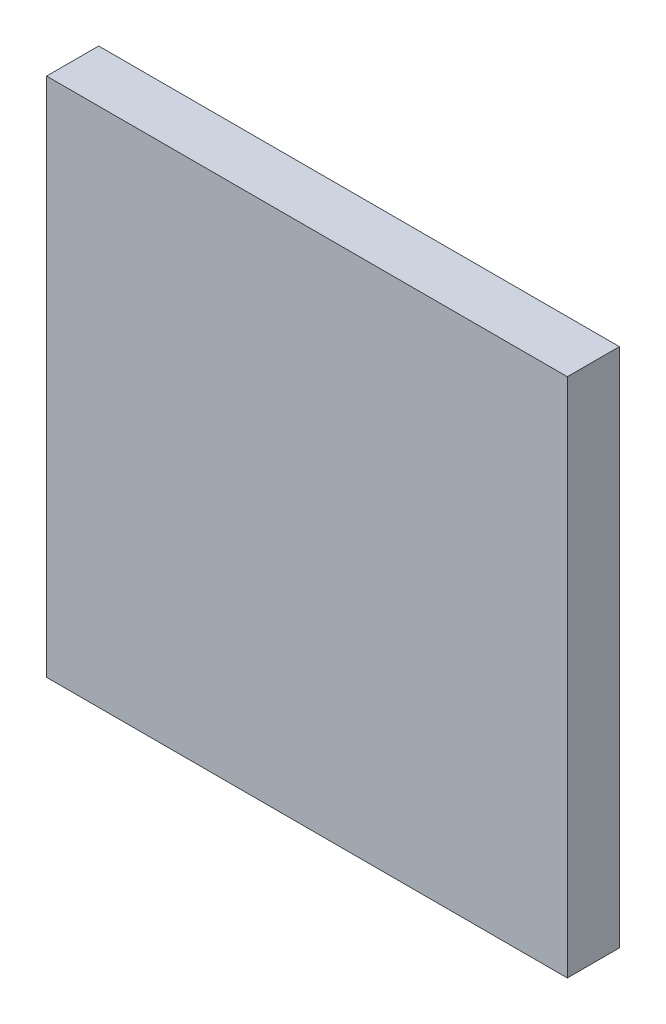
ISO-10303-21;
HEADER;
FILE_DESCRIPTION(('STEP AP214'),'2;1');
FILE_NAME('part.step','',(''),(''),'','','');
FILE_SCHEMA(('AUTOMOTIVE_DESIGN { 1 0 10303 214 1 1 1 1 }'));
ENDSEC;
DATA;
#1=APPLICATION_CONTEXT('core data for automotive mechanical design processes');
#2=APPLICATION_PROTOCOL_DEFINITION('international standard','automotive_design',2000,#1);
#3=PRODUCT_CONTEXT('',#1,'mechanical');
#4=PRODUCT('Part','Part','',(#3));
#5=PRODUCT_RELATED_PRODUCT_CATEGORY('part','',(#4));
#6=PRODUCT_DEFINITION_FORMATION('','',#4);
#7=PRODUCT_DEFINITION_CONTEXT('part definition',#1,'design');
#8=PRODUCT_DEFINITION('design','',#6,#7);
#9=PRODUCT_DEFINITION_SHAPE('','',#8);
#10=(LENGTH_UNIT() NAMED_UNIT(*) SI_UNIT(.MILLI.,.METRE.));
#11=(NAMED_UNIT(*) PLANE_ANGLE_UNIT() SI_UNIT($,.RADIAN.));
#12=(NAMED_UNIT(*) SI_UNIT($,.STERADIAN.) SOLID_ANGLE_UNIT());
#13=UNCERTAINTY_MEASURE_WITH_UNIT(LENGTH_MEASURE(1.E-05),#10,'distance_accuracy_value','');
#14=(GEOMETRIC_REPRESENTATION_CONTEXT(3) GLOBAL_UNCERTAINTY_ASSIGNED_CONTEXT((#13)) GLOBAL_UNIT_ASSIGNED_CONTEXT((#10,
#11,#12)) REPRESENTATION_CONTEXT('',''));
#15=CARTESIAN_POINT('',(0.,0.,0.));
#16=DIRECTION('',(0.,0.,1.));
#17=DIRECTION('',(1.,0.,0.));
#18=AXIS2_PLACEMENT_3D('',#15,#16,#17);
#19=CARTESIAN_POINT('',(-50.,100.,10.));
#20=DIRECTION('',(1.,0.,0.));
#21=DIRECTION('',(0.,1.,0.));
#22=AXIS2_PLACEMENT_3D('',#19,#20,#21);
#23=PLANE('',#22);
#24=DIRECTION('',(0.,-1.,0.));
#25=VECTOR('',#24,1.);
#26=CARTESIAN_POINT('',(-50.,100.,0.));
#27=LINE('',#26,#25);
#28=CARTESIAN_POINT('',(-50.,100.,0.));
#29=VERTEX_POINT('',#28);
#30=CARTESIAN_POINT('',(-50.,0.,0.));
#31=VERTEX_POINT('',#30);
#32=EDGE_CURVE('E142',#29,#31,#27,.T.);
#33=ORIENTED_EDGE('',*,*,#32,.T.);
#34=DIRECTION('',(0.,0.,-1.));
#35=VECTOR('',#34,1.);
#36=CARTESIAN_POINT('',(-50.,0.,10.));
#37=LINE('',#36,#35);
#38=CARTESIAN_POINT('',(-50.,0.,10.));
#39=VERTEX_POINT('',#38);
#40=EDGE_CURVE('E11',#39,#31,#37,.T.);
#41=ORIENTED_EDGE('',*,*,#40,.F.);
#42=DIRECTION('',(0.,-1.,0.));
#43=VECTOR('',#42,1.);
#44=CARTESIAN_POINT('',(-50.,100.,10.));
#45=LINE('',#44,#43);
#46=CARTESIAN_POINT('',(-50.,100.,10.));
#47=VERTEX_POINT('',#46);
#48=EDGE_CURVE('E146',#47,#39,#45,.T.);
#49=ORIENTED_EDGE('',*,*,#48,.F.);
#50=DIRECTION('',(0.,0.,-1.));
#51=VECTOR('',#50,1.);
#52=CARTESIAN_POINT('',(-50.,100.,10.));
#53=LINE('',#52,#51);
#54=EDGE_CURVE('E152',#47,#29,#53,.T.);
#55=ORIENTED_EDGE('',*,*,#54,.T.);
#56=EDGE_LOOP('',(#33,#41,#49,#55));
#57=FACE_BOUND('',#56,.T.);
#58=ADVANCED_FACE('F34',(#57),#23,.F.);
#59=CARTESIAN_POINT('',(-50.,0.,10.));
#60=DIRECTION('',(0.,1.,0.));
#61=DIRECTION('',(0.,0.,1.));
#62=AXIS2_PLACEMENT_3D('',#59,#60,#61);
#63=PLANE('',#62);
#64=DIRECTION('',(1.,0.,0.));
#65=VECTOR('',#64,1.);
#66=CARTESIAN_POINT('',(-50.,0.,0.));
#67=LINE('',#66,#65);
#68=CARTESIAN_POINT('',(50.,0.,0.));
#69=VERTEX_POINT('',#68);
#70=EDGE_CURVE('E155',#31,#69,#67,.T.);
#71=ORIENTED_EDGE('',*,*,#70,.T.);
#72=DIRECTION('',(0.,0.,-1.));
#73=VECTOR('',#72,1.);
#74=CARTESIAN_POINT('',(50.,0.,10.));
#75=LINE('',#74,#73);
#76=CARTESIAN_POINT('',(50.,0.,10.));
#77=VERTEX_POINT('',#76);
#78=EDGE_CURVE('E41',#77,#69,#75,.T.);
#79=ORIENTED_EDGE('',*,*,#78,.F.);
#80=DIRECTION('',(1.,0.,0.));
#81=VECTOR('',#80,1.);
#82=CARTESIAN_POINT('',(-50.,0.,10.));
#83=LINE('',#82,#81);
#84=EDGE_CURVE('E85',#39,#77,#83,.T.);
#85=ORIENTED_EDGE('',*,*,#84,.F.);
#86=ORIENTED_EDGE('',*,*,#40,.T.);
#87=EDGE_LOOP('',(#71,#79,#85,#86));
#88=FACE_BOUND('',#87,.T.);
#89=ADVANCED_FACE('F183',(#88),#63,.F.);
#90=CARTESIAN_POINT('',(50.,100.,10.));
#91=DIRECTION('',(-1.,0.,0.));
#92=DIRECTION('',(0.,-1.,0.));
#93=AXIS2_PLACEMENT_3D('',#90,#91,#92);
#94=PLANE('',#93);
#95=DIRECTION('',(0.,1.,0.));
#96=VECTOR('',#95,1.);
#97=CARTESIAN_POINT('',(50.,100.,0.));
#98=LINE('',#97,#96);
#99=CARTESIAN_POINT('',(50.,100.,0.));
#100=VERTEX_POINT('',#99);
#101=EDGE_CURVE('E157',#69,#100,#98,.T.);
#102=ORIENTED_EDGE('',*,*,#101,.T.);
#103=DIRECTION('',(0.,0.,-1.));
#104=VECTOR('',#103,1.);
#105=CARTESIAN_POINT('',(50.,100.,10.));
#106=LINE('',#105,#104);
#107=CARTESIAN_POINT('',(50.,100.,10.));
#108=VERTEX_POINT('',#107);
#109=EDGE_CURVE('E161',#108,#100,#106,.T.);
#110=ORIENTED_EDGE('',*,*,#109,.F.);
#111=DIRECTION('',(0.,1.,0.));
#112=VECTOR('',#111,1.);
#113=CARTESIAN_POINT('',(50.,100.,10.));
#114=LINE('',#113,#112);
#115=EDGE_CURVE('E149',#77,#108,#114,.T.);
#116=ORIENTED_EDGE('',*,*,#115,.F.);
#117=ORIENTED_EDGE('',*,*,#78,.T.);
#118=EDGE_LOOP('',(#102,#110,#116,#117));
#119=FACE_BOUND('',#118,.T.);
#120=ADVANCED_FACE('F166',(#119),#94,.F.);
#121=CARTESIAN_POINT('',(-50.,100.,10.));
#122=DIRECTION('',(0.,-1.,0.));
#123=DIRECTION('',(0.,0.,-1.));
#124=AXIS2_PLACEMENT_3D('',#121,#122,#123);
#125=PLANE('',#124);
#126=DIRECTION('',(-1.,0.,0.));
#127=VECTOR('',#126,1.);
#128=CARTESIAN_POINT('',(-50.,100.,0.));
#129=LINE('',#128,#127);
#130=EDGE_CURVE('E78',#100,#29,#129,.T.);
#131=ORIENTED_EDGE('',*,*,#130,.T.);
#132=ORIENTED_EDGE('',*,*,#54,.F.);
#133=DIRECTION('',(-1.,0.,0.));
#134=VECTOR('',#133,1.);
#135=CARTESIAN_POINT('',(-50.,100.,10.));
#136=LINE('',#135,#134);
#137=EDGE_CURVE('E57',#108,#47,#136,.T.);
#138=ORIENTED_EDGE('',*,*,#137,.F.);
#139=ORIENTED_EDGE('',*,*,#109,.T.);
#140=EDGE_LOOP('',(#131,#132,#138,#139));
#141=FACE_BOUND('',#140,.T.);
#142=ADVANCED_FACE('F174',(#141),#125,.F.);
#143=CARTESIAN_POINT('',(0.,0.,10.));
#144=DIRECTION('',(0.,0.,1.));
#145=DIRECTION('',(1.,0.,0.));
#146=AXIS2_PLACEMENT_3D('',#143,#144,#145);
#147=PLANE('',#146);
#148=ORIENTED_EDGE('',*,*,#48,.T.);
#149=ORIENTED_EDGE('',*,*,#84,.T.);
#150=ORIENTED_EDGE('',*,*,#115,.T.);
#151=ORIENTED_EDGE('',*,*,#137,.T.);
#152=EDGE_LOOP('',(#148,#149,#150,#151));
#153=FACE_BOUND('',#152,.T.);
#154=ADVANCED_FACE('F176',(#153),#147,.T.);
#155=CARTESIAN_POINT('',(0.,0.,0.));
#156=DIRECTION('',(0.,0.,1.));
#157=DIRECTION('',(1.,0.,0.));
#158=AXIS2_PLACEMENT_3D('',#155,#156,#157);
#159=PLANE('',#158);
#160=DIRECTION('',(-1.,0.,0.));
#161=VECTOR('',#160,1.);
#162=CARTESIAN_POINT('',(43.0961651007777,5.,0.));
#163=LINE('',#162,#161);
#164=CARTESIAN_POINT('',(43.0961651007777,5.,0.));
#165=VERTEX_POINT('',#164);
#166=CARTESIAN_POINT('',(-45.,5.,0.));
#167=VERTEX_POINT('',#166);
#168=EDGE_CURVE('E136',#165,#167,#163,.T.);
#169=ORIENTED_EDGE('',*,*,#168,.F.);
#170=DIRECTION('',(0.,-1.,0.));
#171=VECTOR('',#170,1.);
#172=CARTESIAN_POINT('',(43.0961651007777,95.,0.));
#173=LINE('',#172,#171);
#174=CARTESIAN_POINT('',(43.0961651007777,95.,0.));
#175=VERTEX_POINT('',#174);
#176=EDGE_CURVE('E48',#175,#165,#173,.T.);
#177=ORIENTED_EDGE('',*,*,#176,.F.);
#178=DIRECTION('',(1.,0.,0.));
#179=VECTOR('',#178,1.);
#180=CARTESIAN_POINT('',(43.0961651007777,95.,0.));
#181=LINE('',#180,#179);
#182=CARTESIAN_POINT('',(-45.,95.,0.));
#183=VERTEX_POINT('',#182);
#184=EDGE_CURVE('E127',#183,#175,#181,.T.);
#185=ORIENTED_EDGE('',*,*,#184,.F.);
#186=DIRECTION('',(0.,1.,0.));
#187=VECTOR('',#186,1.);
#188=CARTESIAN_POINT('',(-45.,95.,0.));
#189=LINE('',#188,#187);
#190=EDGE_CURVE('E130',#167,#183,#189,.T.);
#191=ORIENTED_EDGE('',*,*,#190,.F.);
#192=EDGE_LOOP('',(#169,#177,#185,#191));
#193=FACE_BOUND('',#192,.T.);
#194=ORIENTED_EDGE('',*,*,#32,.F.);
#195=ORIENTED_EDGE('',*,*,#130,.F.);
#196=ORIENTED_EDGE('',*,*,#101,.F.);
#197=ORIENTED_EDGE('',*,*,#70,.F.);
#198=EDGE_LOOP('',(#194,#195,#196,#197));
#199=FACE_BOUND('',#198,.T.);
#200=ADVANCED_FACE('F170',(#193,#199),#159,.F.);
#201=CARTESIAN_POINT('',(43.0961651007777,95.,5.));
#202=DIRECTION('',(1.,0.,0.));
#203=DIRECTION('',(0.,1.,0.));
#204=AXIS2_PLACEMENT_3D('',#201,#202,#203);
#205=PLANE('',#204);
#206=ORIENTED_EDGE('',*,*,#176,.T.);
#207=DIRECTION('',(0.,0.,-1.));
#208=VECTOR('',#207,1.);
#209=CARTESIAN_POINT('',(43.0961651007777,5.,5.));
#210=LINE('',#209,#208);
#211=CARTESIAN_POINT('',(43.0961651007777,5.,5.));
#212=VERTEX_POINT('',#211);
#213=EDGE_CURVE('E105',#212,#165,#210,.T.);
#214=ORIENTED_EDGE('',*,*,#213,.F.);
#215=DIRECTION('',(0.,-1.,0.));
#216=VECTOR('',#215,1.);
#217=CARTESIAN_POINT('',(43.0961651007777,95.,5.));
#218=LINE('',#217,#216);
#219=CARTESIAN_POINT('',(43.0961651007777,95.,5.));
#220=VERTEX_POINT('',#219);
#221=EDGE_CURVE('E109',#220,#212,#218,.T.);
#222=ORIENTED_EDGE('',*,*,#221,.F.);
#223=DIRECTION('',(0.,0.,-1.));
#224=VECTOR('',#223,1.);
#225=CARTESIAN_POINT('',(43.0961651007777,95.,5.));
#226=LINE('',#225,#224);
#227=EDGE_CURVE('E140',#220,#175,#226,.T.);
#228=ORIENTED_EDGE('',*,*,#227,.T.);
#229=EDGE_LOOP('',(#206,#214,#222,#228));
#230=FACE_BOUND('',#229,.T.);
#231=ADVANCED_FACE('F107',(#230),#205,.F.);
#232=CARTESIAN_POINT('',(43.0961651007777,95.,5.));
#233=DIRECTION('',(0.,1.,0.));
#234=DIRECTION('',(0.,0.,1.));
#235=AXIS2_PLACEMENT_3D('',#232,#233,#234);
#236=PLANE('',#235);
#237=ORIENTED_EDGE('',*,*,#184,.T.);
#238=ORIENTED_EDGE('',*,*,#227,.F.);
#239=DIRECTION('',(1.,0.,0.));
#240=VECTOR('',#239,1.);
#241=CARTESIAN_POINT('',(43.0961651007777,95.,5.));
#242=LINE('',#241,#240);
#243=CARTESIAN_POINT('',(-45.,95.,5.));
#244=VERTEX_POINT('',#243);
#245=EDGE_CURVE('E115',#244,#220,#242,.T.);
#246=ORIENTED_EDGE('',*,*,#245,.F.);
#247=DIRECTION('',(0.,0.,-1.));
#248=VECTOR('',#247,1.);
#249=CARTESIAN_POINT('',(-45.,95.,5.));
#250=LINE('',#249,#248);
#251=EDGE_CURVE('E143',#244,#183,#250,.T.);
#252=ORIENTED_EDGE('',*,*,#251,.T.);
#253=EDGE_LOOP('',(#237,#238,#246,#252));
#254=FACE_BOUND('',#253,.T.);
#255=ADVANCED_FACE('F238',(#254),#236,.F.);
#256=CARTESIAN_POINT('',(-45.,95.,5.));
#257=DIRECTION('',(-1.,0.,0.));
#258=DIRECTION('',(0.,-1.,0.));
#259=AXIS2_PLACEMENT_3D('',#256,#257,#258);
#260=PLANE('',#259);
#261=ORIENTED_EDGE('',*,*,#190,.T.);
#262=ORIENTED_EDGE('',*,*,#251,.F.);
#263=DIRECTION('',(0.,1.,0.));
#264=VECTOR('',#263,1.);
#265=CARTESIAN_POINT('',(-45.,95.,5.));
#266=LINE('',#265,#264);
#267=CARTESIAN_POINT('',(-45.,5.,5.));
#268=VERTEX_POINT('',#267);
#269=EDGE_CURVE('E123',#268,#244,#266,.T.);
#270=ORIENTED_EDGE('',*,*,#269,.F.);
#271=DIRECTION('',(0.,0.,-1.));
#272=VECTOR('',#271,1.);
#273=CARTESIAN_POINT('',(-45.,5.,5.));
#274=LINE('',#273,#272);
#275=EDGE_CURVE('E114',#268,#167,#274,.T.);
#276=ORIENTED_EDGE('',*,*,#275,.T.);
#277=EDGE_LOOP('',(#261,#262,#270,#276));
#278=FACE_BOUND('',#277,.T.);
#279=ADVANCED_FACE('F246',(#278),#260,.F.);
#280=CARTESIAN_POINT('',(43.0961651007777,5.,5.));
#281=DIRECTION('',(0.,-1.,0.));
#282=DIRECTION('',(0.,0.,-1.));
#283=AXIS2_PLACEMENT_3D('',#280,#281,#282);
#284=PLANE('',#283);
#285=ORIENTED_EDGE('',*,*,#168,.T.);
#286=ORIENTED_EDGE('',*,*,#275,.F.);
#287=DIRECTION('',(-1.,0.,0.));
#288=VECTOR('',#287,1.);
#289=CARTESIAN_POINT('',(43.0961651007777,5.,5.));
#290=LINE('',#289,#288);
#291=EDGE_CURVE('E118',#212,#268,#290,.T.);
#292=ORIENTED_EDGE('',*,*,#291,.F.);
#293=ORIENTED_EDGE('',*,*,#213,.T.);
#294=EDGE_LOOP('',(#285,#286,#292,#293));
#295=FACE_BOUND('',#294,.T.);
#296=ADVANCED_FACE('F119',(#295),#284,.F.);
#297=CARTESIAN_POINT('',(0.,0.,5.));
#298=DIRECTION('',(0.,0.,-1.));
#299=DIRECTION('',(-1.,0.,0.));
#300=AXIS2_PLACEMENT_3D('',#297,#298,#299);
#301=PLANE('',#300);
#302=ORIENTED_EDGE('',*,*,#221,.T.);
#303=ORIENTED_EDGE('',*,*,#291,.T.);
#304=ORIENTED_EDGE('',*,*,#269,.T.);
#305=ORIENTED_EDGE('',*,*,#245,.T.);
#306=EDGE_LOOP('',(#302,#303,#304,#305));
#307=FACE_BOUND('',#306,.T.);
#308=ADVANCED_FACE('F125',(#307),#301,.T.);
#309=CLOSED_SHELL('',(#58,#89,#120,#142,#154,#200,#231,#255,#279,#296,#308));
#310=MANIFOLD_SOLID_BREP('B2',#309);
#311=ADVANCED_BREP_SHAPE_REPRESENTATION('',(#18,#310),#14);
#312=SHAPE_DEFINITION_REPRESENTATION(#9,#311);
ENDSEC;
END-ISO-10303-21;
